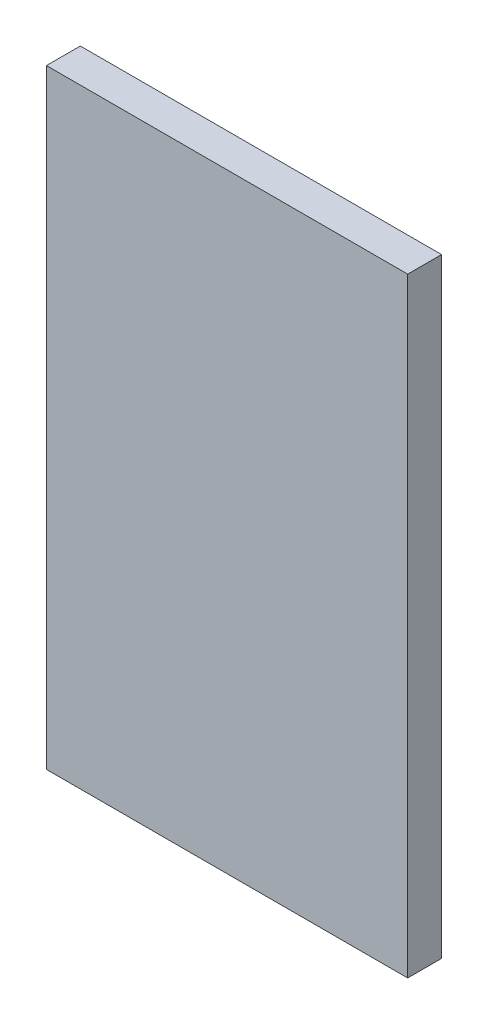
ISO-10303-21;
HEADER;
FILE_DESCRIPTION(('STEP AP214'),'2;1');
FILE_NAME('part.step','',(''),(''),'','','');
FILE_SCHEMA(('AUTOMOTIVE_DESIGN { 1 0 10303 214 1 1 1 1 }'));
ENDSEC;
DATA;
#1=APPLICATION_CONTEXT('core data for automotive mechanical design processes');
#2=APPLICATION_PROTOCOL_DEFINITION('international standard','automotive_design',2000,#1);
#3=PRODUCT_CONTEXT('',#1,'mechanical');
#4=PRODUCT('Part','Part','',(#3));
#5=PRODUCT_RELATED_PRODUCT_CATEGORY('part','',(#4));
#6=PRODUCT_DEFINITION_FORMATION('','',#4);
#7=PRODUCT_DEFINITION_CONTEXT('part definition',#1,'design');
#8=PRODUCT_DEFINITION('design','',#6,#7);
#9=PRODUCT_DEFINITION_SHAPE('','',#8);
#10=(LENGTH_UNIT() NAMED_UNIT(*) SI_UNIT(.MILLI.,.METRE.));
#11=(NAMED_UNIT(*) PLANE_ANGLE_UNIT() SI_UNIT($,.RADIAN.));
#12=(NAMED_UNIT(*) SI_UNIT($,.STERADIAN.) SOLID_ANGLE_UNIT());
#13=UNCERTAINTY_MEASURE_WITH_UNIT(LENGTH_MEASURE(1.E-05),#10,'distance_accuracy_value','');
#14=(GEOMETRIC_REPRESENTATION_CONTEXT(3) GLOBAL_UNCERTAINTY_ASSIGNED_CONTEXT((#13)) GLOBAL_UNIT_ASSIGNED_CONTEXT((#10,
#11,#12)) REPRESENTATION_CONTEXT('',''));
#15=CARTESIAN_POINT('',(0.,0.,0.));
#16=DIRECTION('',(0.,0.,1.));
#17=DIRECTION('',(1.,0.,0.));
#18=AXIS2_PLACEMENT_3D('',#15,#16,#17);
#19=CARTESIAN_POINT('',(101.6,171.45,19.05));
#20=DIRECTION('',(-1.,0.,0.));
#21=DIRECTION('',(0.,-1.,0.));
#22=AXIS2_PLACEMENT_3D('',#19,#20,#21);
#23=PLANE('',#22);
#24=DIRECTION('',(0.,1.,0.));
#25=VECTOR('',#24,1.);
#26=CARTESIAN_POINT('',(101.6,171.45,0.));
#27=LINE('',#26,#25);
#28=CARTESIAN_POINT('',(101.6,-171.45,0.));
#29=VERTEX_POINT('',#28);
#30=CARTESIAN_POINT('',(101.6,171.45,0.));
#31=VERTEX_POINT('',#30);
#32=EDGE_CURVE('E96',#29,#31,#27,.T.);
#33=ORIENTED_EDGE('',*,*,#32,.T.);
#34=DIRECTION('',(0.,0.,-1.));
#35=VECTOR('',#34,1.);
#36=CARTESIAN_POINT('',(101.6,171.45,19.05));
#37=LINE('',#36,#35);
#38=CARTESIAN_POINT('',(101.6,171.45,19.05));
#39=VERTEX_POINT('',#38);
#40=EDGE_CURVE('E11',#39,#31,#37,.T.);
#41=ORIENTED_EDGE('',*,*,#40,.F.);
#42=DIRECTION('',(0.,1.,0.));
#43=VECTOR('',#42,1.);
#44=CARTESIAN_POINT('',(101.6,171.45,19.05));
#45=LINE('',#44,#43);
#46=CARTESIAN_POINT('',(101.6,-171.45,19.05));
#47=VERTEX_POINT('',#46);
#48=EDGE_CURVE('E84',#47,#39,#45,.T.);
#49=ORIENTED_EDGE('',*,*,#48,.F.);
#50=DIRECTION('',(0.,0.,-1.));
#51=VECTOR('',#50,1.);
#52=CARTESIAN_POINT('',(101.6,-171.45,19.05));
#53=LINE('',#52,#51);
#54=EDGE_CURVE('E92',#47,#29,#53,.T.);
#55=ORIENTED_EDGE('',*,*,#54,.T.);
#56=EDGE_LOOP('',(#33,#41,#49,#55));
#57=FACE_BOUND('',#56,.T.);
#58=ADVANCED_FACE('F33',(#57),#23,.F.);
#59=CARTESIAN_POINT('',(-101.6,171.45,19.05));
#60=DIRECTION('',(0.,-1.,0.));
#61=DIRECTION('',(0.,0.,-1.));
#62=AXIS2_PLACEMENT_3D('',#59,#60,#61);
#63=PLANE('',#62);
#64=DIRECTION('',(-1.,0.,0.));
#65=VECTOR('',#64,1.);
#66=CARTESIAN_POINT('',(-101.6,171.45,0.));
#67=LINE('',#66,#65);
#68=CARTESIAN_POINT('',(-101.6,171.45,0.));
#69=VERTEX_POINT('',#68);
#70=EDGE_CURVE('E88',#31,#69,#67,.T.);
#71=ORIENTED_EDGE('',*,*,#70,.T.);
#72=DIRECTION('',(0.,0.,-1.));
#73=VECTOR('',#72,1.);
#74=CARTESIAN_POINT('',(-101.6,171.45,19.05));
#75=LINE('',#74,#73);
#76=CARTESIAN_POINT('',(-101.6,171.45,19.05));
#77=VERTEX_POINT('',#76);
#78=EDGE_CURVE('E41',#77,#69,#75,.T.);
#79=ORIENTED_EDGE('',*,*,#78,.F.);
#80=DIRECTION('',(-1.,0.,0.));
#81=VECTOR('',#80,1.);
#82=CARTESIAN_POINT('',(-101.6,171.45,19.05));
#83=LINE('',#82,#81);
#84=EDGE_CURVE('E79',#39,#77,#83,.T.);
#85=ORIENTED_EDGE('',*,*,#84,.F.);
#86=ORIENTED_EDGE('',*,*,#40,.T.);
#87=EDGE_LOOP('',(#71,#79,#85,#86));
#88=FACE_BOUND('',#87,.T.);
#89=ADVANCED_FACE('F87',(#88),#63,.F.);
#90=CARTESIAN_POINT('',(-101.6,171.45,19.05));
#91=DIRECTION('',(1.,0.,0.));
#92=DIRECTION('',(0.,1.,0.));
#93=AXIS2_PLACEMENT_3D('',#90,#91,#92);
#94=PLANE('',#93);
#95=DIRECTION('',(0.,-1.,0.));
#96=VECTOR('',#95,1.);
#97=CARTESIAN_POINT('',(-101.6,171.45,0.));
#98=LINE('',#97,#96);
#99=CARTESIAN_POINT('',(-101.6,-171.45,0.));
#100=VERTEX_POINT('',#99);
#101=EDGE_CURVE('E66',#69,#100,#98,.T.);
#102=ORIENTED_EDGE('',*,*,#101,.T.);
#103=DIRECTION('',(0.,0.,-1.));
#104=VECTOR('',#103,1.);
#105=CARTESIAN_POINT('',(-101.6,-171.45,19.05));
#106=LINE('',#105,#104);
#107=CARTESIAN_POINT('',(-101.6,-171.45,19.05));
#108=VERTEX_POINT('',#107);
#109=EDGE_CURVE('E89',#108,#100,#106,.T.);
#110=ORIENTED_EDGE('',*,*,#109,.F.);
#111=DIRECTION('',(0.,-1.,0.));
#112=VECTOR('',#111,1.);
#113=CARTESIAN_POINT('',(-101.6,171.45,19.05));
#114=LINE('',#113,#112);
#115=EDGE_CURVE('E82',#77,#108,#114,.T.);
#116=ORIENTED_EDGE('',*,*,#115,.F.);
#117=ORIENTED_EDGE('',*,*,#78,.T.);
#118=EDGE_LOOP('',(#102,#110,#116,#117));
#119=FACE_BOUND('',#118,.T.);
#120=ADVANCED_FACE('F90',(#119),#94,.F.);
#121=CARTESIAN_POINT('',(-101.6,-171.45,19.05));
#122=DIRECTION('',(0.,1.,0.));
#123=DIRECTION('',(0.,0.,1.));
#124=AXIS2_PLACEMENT_3D('',#121,#122,#123);
#125=PLANE('',#124);
#126=DIRECTION('',(1.,0.,0.));
#127=VECTOR('',#126,1.);
#128=CARTESIAN_POINT('',(-101.6,-171.45,0.));
#129=LINE('',#128,#127);
#130=EDGE_CURVE('E72',#100,#29,#129,.T.);
#131=ORIENTED_EDGE('',*,*,#130,.T.);
#132=ORIENTED_EDGE('',*,*,#54,.F.);
#133=DIRECTION('',(1.,0.,0.));
#134=VECTOR('',#133,1.);
#135=CARTESIAN_POINT('',(-101.6,-171.45,19.05));
#136=LINE('',#135,#134);
#137=EDGE_CURVE('E49',#108,#47,#136,.T.);
#138=ORIENTED_EDGE('',*,*,#137,.F.);
#139=ORIENTED_EDGE('',*,*,#109,.T.);
#140=EDGE_LOOP('',(#131,#132,#138,#139));
#141=FACE_BOUND('',#140,.T.);
#142=ADVANCED_FACE('F103',(#141),#125,.F.);
#143=CARTESIAN_POINT('',(0.,0.,19.05));
#144=DIRECTION('',(0.,0.,1.));
#145=DIRECTION('',(1.,0.,0.));
#146=AXIS2_PLACEMENT_3D('',#143,#144,#145);
#147=PLANE('',#146);
#148=ORIENTED_EDGE('',*,*,#48,.T.);
#149=ORIENTED_EDGE('',*,*,#84,.T.);
#150=ORIENTED_EDGE('',*,*,#115,.T.);
#151=ORIENTED_EDGE('',*,*,#137,.T.);
#152=EDGE_LOOP('',(#148,#149,#150,#151));
#153=FACE_BOUND('',#152,.T.);
#154=ADVANCED_FACE('F80',(#153),#147,.T.);
#155=CARTESIAN_POINT('',(0.,0.,0.));
#156=DIRECTION('',(0.,0.,1.));
#157=DIRECTION('',(1.,0.,0.));
#158=AXIS2_PLACEMENT_3D('',#155,#156,#157);
#159=PLANE('',#158);
#160=ORIENTED_EDGE('',*,*,#32,.F.);
#161=ORIENTED_EDGE('',*,*,#130,.F.);
#162=ORIENTED_EDGE('',*,*,#101,.F.);
#163=ORIENTED_EDGE('',*,*,#70,.F.);
#164=EDGE_LOOP('',(#160,#161,#162,#163));
#165=FACE_BOUND('',#164,.T.);
#166=ADVANCED_FACE('F106',(#165),#159,.F.);
#167=CLOSED_SHELL('',(#58,#89,#120,#142,#154,#166));
#168=MANIFOLD_SOLID_BREP('B2',#167);
#169=ADVANCED_BREP_SHAPE_REPRESENTATION('',(#18,#168),#14);
#170=SHAPE_DEFINITION_REPRESENTATION(#9,#169);
ENDSEC;
END-ISO-10303-21;
